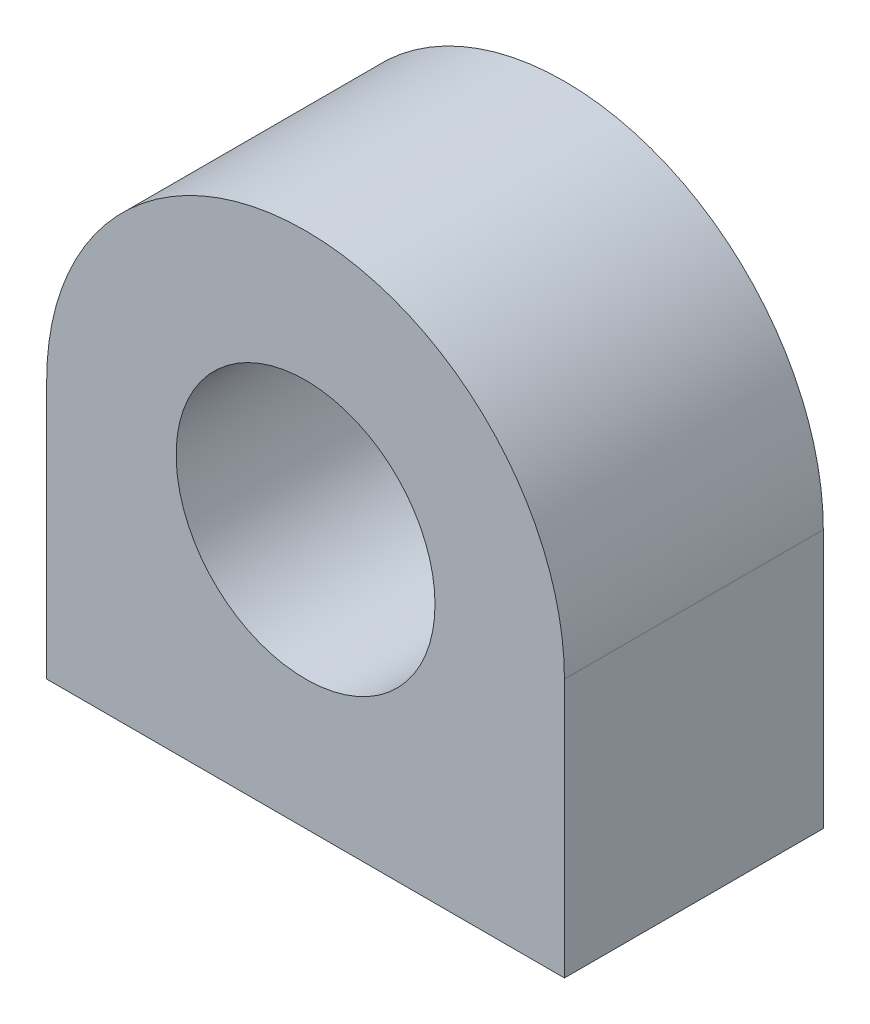
ISO-10303-21;
HEADER;
FILE_DESCRIPTION(('STEP AP214'),'2;1');
FILE_NAME('part.step','',(''),(''),'','','');
FILE_SCHEMA(('AUTOMOTIVE_DESIGN { 1 0 10303 214 1 1 1 1 }'));
ENDSEC;
DATA;
#1=APPLICATION_CONTEXT('core data for automotive mechanical design processes');
#2=APPLICATION_PROTOCOL_DEFINITION('international standard','automotive_design',2000,#1);
#3=PRODUCT_CONTEXT('',#1,'mechanical');
#4=PRODUCT('Part','Part','',(#3));
#5=PRODUCT_RELATED_PRODUCT_CATEGORY('part','',(#4));
#6=PRODUCT_DEFINITION_FORMATION('','',#4);
#7=PRODUCT_DEFINITION_CONTEXT('part definition',#1,'design');
#8=PRODUCT_DEFINITION('design','',#6,#7);
#9=PRODUCT_DEFINITION_SHAPE('','',#8);
#10=(LENGTH_UNIT() NAMED_UNIT(*) SI_UNIT(.MILLI.,.METRE.));
#11=(NAMED_UNIT(*) PLANE_ANGLE_UNIT() SI_UNIT($,.RADIAN.));
#12=(NAMED_UNIT(*) SI_UNIT($,.STERADIAN.) SOLID_ANGLE_UNIT());
#13=UNCERTAINTY_MEASURE_WITH_UNIT(LENGTH_MEASURE(1.E-05),#10,'distance_accuracy_value','');
#14=(GEOMETRIC_REPRESENTATION_CONTEXT(3) GLOBAL_UNCERTAINTY_ASSIGNED_CONTEXT((#13)) GLOBAL_UNIT_ASSIGNED_CONTEXT((#10,
#11,#12)) REPRESENTATION_CONTEXT('',''));
#15=CARTESIAN_POINT('',(0.,0.,0.));
#16=DIRECTION('',(0.,0.,1.));
#17=DIRECTION('',(1.,0.,0.));
#18=AXIS2_PLACEMENT_3D('',#15,#16,#17);
#19=CARTESIAN_POINT('',(10.,10.,10.));
#20=DIRECTION('',(0.,0.,-1.));
#21=DIRECTION('',(-1.,0.,0.));
#22=AXIS2_PLACEMENT_3D('',#19,#20,#21);
#23=PLANE('',#22);
#24=DIRECTION('',(0.,-1.,0.));
#25=VECTOR('',#24,1.);
#26=CARTESIAN_POINT('',(0.,0.,10.));
#27=LINE('',#26,#25);
#28=CARTESIAN_POINT('',(0.,10.,10.));
#29=VERTEX_POINT('',#28);
#30=CARTESIAN_POINT('',(0.,0.,10.));
#31=VERTEX_POINT('',#30);
#32=EDGE_CURVE('E91',#29,#31,#27,.T.);
#33=ORIENTED_EDGE('',*,*,#32,.T.);
#34=DIRECTION('',(1.,0.,0.));
#35=VECTOR('',#34,1.);
#36=CARTESIAN_POINT('',(0.,0.,10.));
#37=LINE('',#36,#35);
#38=CARTESIAN_POINT('',(20.,0.,10.));
#39=VERTEX_POINT('',#38);
#40=EDGE_CURVE('E86',#31,#39,#37,.T.);
#41=ORIENTED_EDGE('',*,*,#40,.T.);
#42=DIRECTION('',(0.,1.,0.));
#43=VECTOR('',#42,1.);
#44=CARTESIAN_POINT('',(20.,0.,10.));
#45=LINE('',#44,#43);
#46=CARTESIAN_POINT('',(20.,10.,10.));
#47=VERTEX_POINT('',#46);
#48=EDGE_CURVE('E89',#39,#47,#45,.T.);
#49=ORIENTED_EDGE('',*,*,#48,.T.);
#50=CARTESIAN_POINT('',(10.,10.,10.));
#51=DIRECTION('',(0.,0.,1.));
#52=DIRECTION('',(-1.,0.,0.));
#53=AXIS2_PLACEMENT_3D('',#50,#51,#52);
#54=CIRCLE('',#53,10.);
#55=EDGE_CURVE('E56',#47,#29,#54,.T.);
#56=ORIENTED_EDGE('',*,*,#55,.T.);
#57=EDGE_LOOP('',(#33,#41,#49,#56));
#58=FACE_BOUND('',#57,.T.);
#59=CARTESIAN_POINT('',(10.,10.,10.));
#60=DIRECTION('',(0.,0.,1.));
#61=DIRECTION('',(1.,0.,0.));
#62=AXIS2_PLACEMENT_3D('',#59,#60,#61);
#63=CIRCLE('',#62,5.);
#64=CARTESIAN_POINT('',(15.,10.,10.));
#65=VERTEX_POINT('',#64);
#66=EDGE_CURVE('E106',#65,#65,#63,.T.);
#67=ORIENTED_EDGE('',*,*,#66,.F.);
#68=EDGE_LOOP('',(#67));
#69=FACE_BOUND('',#68,.T.);
#70=ADVANCED_FACE('F39',(#58,#69),#23,.F.);
#71=CARTESIAN_POINT('',(10.,10.,0.));
#72=DIRECTION('',(0.,0.,-1.));
#73=DIRECTION('',(-1.,0.,0.));
#74=AXIS2_PLACEMENT_3D('',#71,#72,#73);
#75=PLANE('',#74);
#76=DIRECTION('',(0.,-1.,0.));
#77=VECTOR('',#76,1.);
#78=CARTESIAN_POINT('',(0.,0.,0.));
#79=LINE('',#78,#77);
#80=CARTESIAN_POINT('',(0.,10.,0.));
#81=VERTEX_POINT('',#80);
#82=CARTESIAN_POINT('',(0.,0.,0.));
#83=VERTEX_POINT('',#82);
#84=EDGE_CURVE('E103',#81,#83,#79,.T.);
#85=ORIENTED_EDGE('',*,*,#84,.F.);
#86=CARTESIAN_POINT('',(10.,10.,0.));
#87=DIRECTION('',(0.,0.,1.));
#88=DIRECTION('',(-1.,0.,0.));
#89=AXIS2_PLACEMENT_3D('',#86,#87,#88);
#90=CIRCLE('',#89,10.);
#91=CARTESIAN_POINT('',(20.,10.,0.));
#92=VERTEX_POINT('',#91);
#93=EDGE_CURVE('E79',#92,#81,#90,.T.);
#94=ORIENTED_EDGE('',*,*,#93,.F.);
#95=DIRECTION('',(0.,1.,0.));
#96=VECTOR('',#95,1.);
#97=CARTESIAN_POINT('',(20.,0.,0.));
#98=LINE('',#97,#96);
#99=CARTESIAN_POINT('',(20.,0.,0.));
#100=VERTEX_POINT('',#99);
#101=EDGE_CURVE('E73',#100,#92,#98,.T.);
#102=ORIENTED_EDGE('',*,*,#101,.F.);
#103=DIRECTION('',(1.,0.,0.));
#104=VECTOR('',#103,1.);
#105=CARTESIAN_POINT('',(0.,0.,0.));
#106=LINE('',#105,#104);
#107=EDGE_CURVE('E95',#83,#100,#106,.T.);
#108=ORIENTED_EDGE('',*,*,#107,.F.);
#109=EDGE_LOOP('',(#85,#94,#102,#108));
#110=FACE_BOUND('',#109,.T.);
#111=CARTESIAN_POINT('',(10.,10.,0.));
#112=DIRECTION('',(0.,0.,1.));
#113=DIRECTION('',(1.,0.,0.));
#114=AXIS2_PLACEMENT_3D('',#111,#112,#113);
#115=CIRCLE('',#114,5.);
#116=CARTESIAN_POINT('',(15.,10.,0.));
#117=VERTEX_POINT('',#116);
#118=EDGE_CURVE('E118',#117,#117,#115,.T.);
#119=ORIENTED_EDGE('',*,*,#118,.T.);
#120=EDGE_LOOP('',(#119));
#121=FACE_BOUND('',#120,.T.);
#122=ADVANCED_FACE('F114',(#110,#121),#75,.T.);
#123=CARTESIAN_POINT('',(0.,0.,10.));
#124=DIRECTION('',(1.,0.,0.));
#125=DIRECTION('',(0.,0.,-1.));
#126=AXIS2_PLACEMENT_3D('',#123,#124,#125);
#127=PLANE('',#126);
#128=ORIENTED_EDGE('',*,*,#84,.T.);
#129=DIRECTION('',(0.,0.,-1.));
#130=VECTOR('',#129,1.);
#131=CARTESIAN_POINT('',(0.,0.,10.));
#132=LINE('',#131,#130);
#133=EDGE_CURVE('E11',#31,#83,#132,.T.);
#134=ORIENTED_EDGE('',*,*,#133,.F.);
#135=ORIENTED_EDGE('',*,*,#32,.F.);
#136=DIRECTION('',(0.,0.,-1.));
#137=VECTOR('',#136,1.);
#138=CARTESIAN_POINT('',(0.,10.,10.));
#139=LINE('',#138,#137);
#140=EDGE_CURVE('E99',#29,#81,#139,.T.);
#141=ORIENTED_EDGE('',*,*,#140,.T.);
#142=EDGE_LOOP('',(#128,#134,#135,#141));
#143=FACE_BOUND('',#142,.T.);
#144=ADVANCED_FACE('F41',(#143),#127,.F.);
#145=CARTESIAN_POINT('',(0.,0.,10.));
#146=DIRECTION('',(0.,1.,0.));
#147=DIRECTION('',(0.,0.,1.));
#148=AXIS2_PLACEMENT_3D('',#145,#146,#147);
#149=PLANE('',#148);
#150=ORIENTED_EDGE('',*,*,#107,.T.);
#151=DIRECTION('',(0.,0.,-1.));
#152=VECTOR('',#151,1.);
#153=CARTESIAN_POINT('',(20.,0.,10.));
#154=LINE('',#153,#152);
#155=EDGE_CURVE('E48',#39,#100,#154,.T.);
#156=ORIENTED_EDGE('',*,*,#155,.F.);
#157=ORIENTED_EDGE('',*,*,#40,.F.);
#158=ORIENTED_EDGE('',*,*,#133,.T.);
#159=EDGE_LOOP('',(#150,#156,#157,#158));
#160=FACE_BOUND('',#159,.T.);
#161=ADVANCED_FACE('F94',(#160),#149,.F.);
#162=CARTESIAN_POINT('',(20.,0.,10.));
#163=DIRECTION('',(-1.,0.,0.));
#164=DIRECTION('',(0.,0.,1.));
#165=AXIS2_PLACEMENT_3D('',#162,#163,#164);
#166=PLANE('',#165);
#167=ORIENTED_EDGE('',*,*,#101,.T.);
#168=DIRECTION('',(0.,0.,-1.));
#169=VECTOR('',#168,1.);
#170=CARTESIAN_POINT('',(20.,10.,10.));
#171=LINE('',#170,#169);
#172=EDGE_CURVE('E96',#47,#92,#171,.T.);
#173=ORIENTED_EDGE('',*,*,#172,.F.);
#174=ORIENTED_EDGE('',*,*,#48,.F.);
#175=ORIENTED_EDGE('',*,*,#155,.T.);
#176=EDGE_LOOP('',(#167,#173,#174,#175));
#177=FACE_BOUND('',#176,.T.);
#178=ADVANCED_FACE('F97',(#177),#166,.F.);
#179=CARTESIAN_POINT('',(10.,10.,10.));
#180=DIRECTION('',(0.,0.,-1.));
#181=DIRECTION('',(-1.,0.,0.));
#182=AXIS2_PLACEMENT_3D('',#179,#180,#181);
#183=CYLINDRICAL_SURFACE('',#182,10.);
#184=ORIENTED_EDGE('',*,*,#93,.T.);
#185=ORIENTED_EDGE('',*,*,#140,.F.);
#186=ORIENTED_EDGE('',*,*,#55,.F.);
#187=ORIENTED_EDGE('',*,*,#172,.T.);
#188=EDGE_LOOP('',(#184,#185,#186,#187));
#189=FACE_BOUND('',#188,.T.);
#190=ADVANCED_FACE('F111',(#189),#183,.T.);
#191=CARTESIAN_POINT('',(10.,10.,10.));
#192=DIRECTION('',(0.,0.,-1.));
#193=DIRECTION('',(-1.,0.,0.));
#194=AXIS2_PLACEMENT_3D('',#191,#192,#193);
#195=CYLINDRICAL_SURFACE('',#194,5.);
#196=ORIENTED_EDGE('',*,*,#66,.T.);
#197=EDGE_LOOP('',(#196));
#198=FACE_BOUND('',#197,.T.);
#199=ORIENTED_EDGE('',*,*,#118,.F.);
#200=EDGE_LOOP('',(#199));
#201=FACE_BOUND('',#200,.T.);
#202=ADVANCED_FACE('F124',(#198,#201),#195,.F.);
#203=CLOSED_SHELL('',(#70,#122,#144,#161,#178,#190,#202));
#204=MANIFOLD_SOLID_BREP('B2',#203);
#205=ADVANCED_BREP_SHAPE_REPRESENTATION('',(#18,#204),#14);
#206=SHAPE_DEFINITION_REPRESENTATION(#9,#205);
ENDSEC;
END-ISO-10303-21;
